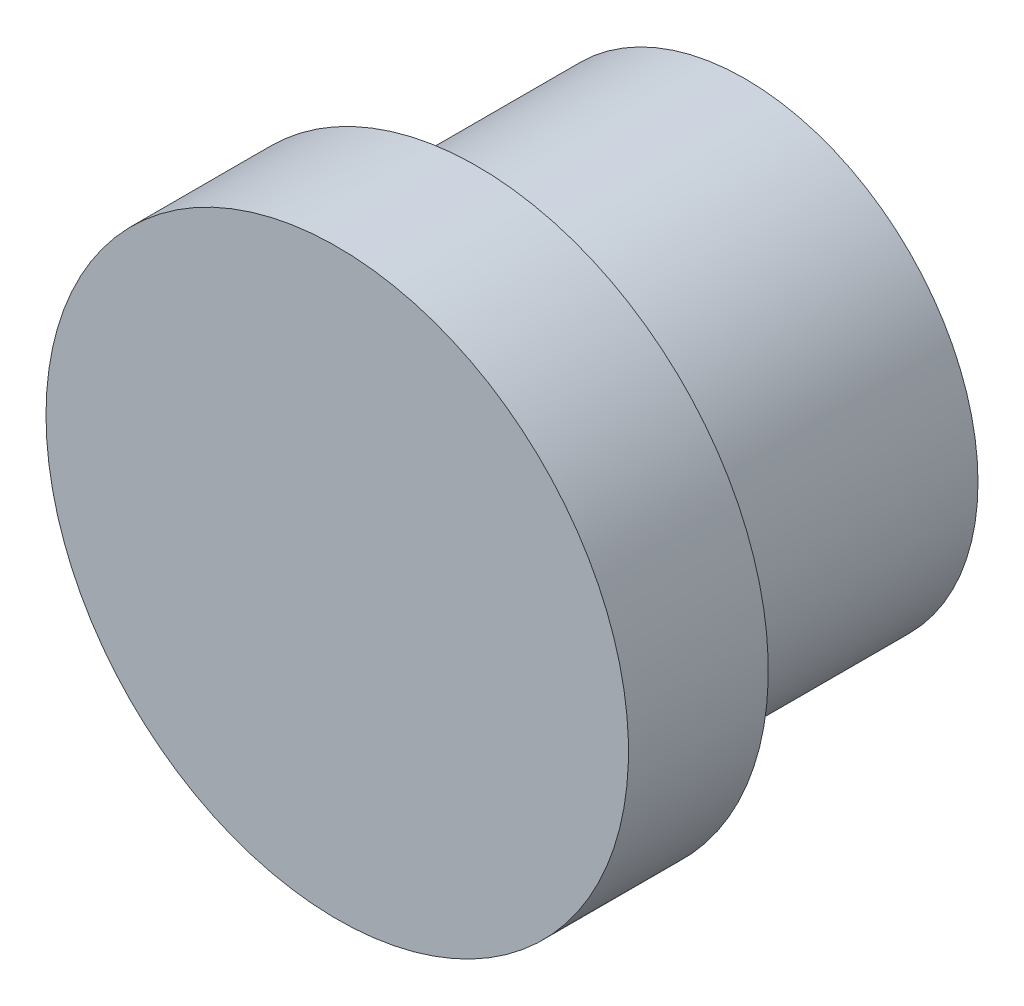
ISO-10303-21;
HEADER;
FILE_DESCRIPTION(('STEP AP214'),'2;1');
FILE_NAME('part.step','',(''),(''),'','','');
FILE_SCHEMA(('AUTOMOTIVE_DESIGN { 1 0 10303 214 1 1 1 1 }'));
ENDSEC;
DATA;
#1=APPLICATION_CONTEXT('core data for automotive mechanical design processes');
#2=APPLICATION_PROTOCOL_DEFINITION('international standard','automotive_design',2000,#1);
#3=PRODUCT_CONTEXT('',#1,'mechanical');
#4=PRODUCT('Part','Part','',(#3));
#5=PRODUCT_RELATED_PRODUCT_CATEGORY('part','',(#4));
#6=PRODUCT_DEFINITION_FORMATION('','',#4);
#7=PRODUCT_DEFINITION_CONTEXT('part definition',#1,'design');
#8=PRODUCT_DEFINITION('design','',#6,#7);
#9=PRODUCT_DEFINITION_SHAPE('','',#8);
#10=(LENGTH_UNIT() NAMED_UNIT(*) SI_UNIT(.MILLI.,.METRE.));
#11=(NAMED_UNIT(*) PLANE_ANGLE_UNIT() SI_UNIT($,.RADIAN.));
#12=(NAMED_UNIT(*) SI_UNIT($,.STERADIAN.) SOLID_ANGLE_UNIT());
#13=UNCERTAINTY_MEASURE_WITH_UNIT(LENGTH_MEASURE(1.E-05),#10,'distance_accuracy_value','');
#14=(GEOMETRIC_REPRESENTATION_CONTEXT(3) GLOBAL_UNCERTAINTY_ASSIGNED_CONTEXT((#13)) GLOBAL_UNIT_ASSIGNED_CONTEXT((#10,
#11,#12)) REPRESENTATION_CONTEXT('',''));
#15=CARTESIAN_POINT('',(0.,0.,0.));
#16=DIRECTION('',(0.,0.,1.));
#17=DIRECTION('',(1.,0.,0.));
#18=AXIS2_PLACEMENT_3D('',#15,#16,#17);
#19=CARTESIAN_POINT('',(-14.1000000000013,-193.95,252.124757540875));
#20=DIRECTION('',(0.,0.,-1.));
#21=DIRECTION('',(0.,-1.,0.));
#22=AXIS2_PLACEMENT_3D('',#19,#20,#21);
#23=PLANE('',#22);
#24=CARTESIAN_POINT('',(-14.1000000000013,-193.95,252.124757540875));
#25=DIRECTION('',(0.,0.,-1.));
#26=DIRECTION('',(-1.,0.,0.));
#27=AXIS2_PLACEMENT_3D('',#24,#25,#26);
#28=CIRCLE('',#27,2.5);
#29=CARTESIAN_POINT('',(-16.6000000000013,-193.95,252.124757540875));
#30=VERTEX_POINT('',#29);
#31=EDGE_CURVE('E47',#30,#30,#28,.T.);
#32=ORIENTED_EDGE('',*,*,#31,.F.);
#33=EDGE_LOOP('',(#32));
#34=FACE_BOUND('',#33,.T.);
#35=ADVANCED_FACE('F43',(#34),#23,.F.);
#36=CARTESIAN_POINT('',(-14.1000000000013,-193.95,250.924757540876));
#37=DIRECTION('',(0.,0.,-1.));
#38=DIRECTION('',(0.,-1.,0.));
#39=AXIS2_PLACEMENT_3D('',#36,#37,#38);
#40=PLANE('',#39);
#41=CARTESIAN_POINT('',(-14.1000000000013,-193.95,250.924757540876));
#42=DIRECTION('',(0.,0.,-1.));
#43=DIRECTION('',(-1.,0.,0.));
#44=AXIS2_PLACEMENT_3D('',#41,#42,#43);
#45=CIRCLE('',#44,2.5);
#46=CARTESIAN_POINT('',(-16.6000000000013,-193.95,250.924757540876));
#47=VERTEX_POINT('',#46);
#48=EDGE_CURVE('E11',#47,#47,#45,.T.);
#49=ORIENTED_EDGE('',*,*,#48,.T.);
#50=EDGE_LOOP('',(#49));
#51=FACE_BOUND('',#50,.T.);
#52=CARTESIAN_POINT('',(-14.1000000000013,-193.95,250.924757540876));
#53=DIRECTION('',(0.,0.,1.));
#54=DIRECTION('',(-1.,0.,0.));
#55=AXIS2_PLACEMENT_3D('',#52,#53,#54);
#56=CIRCLE('',#55,2.);
#57=CARTESIAN_POINT('',(-16.1000000000013,-193.95,250.924757540876));
#58=VERTEX_POINT('',#57);
#59=EDGE_CURVE('E64',#58,#58,#56,.T.);
#60=ORIENTED_EDGE('',*,*,#59,.T.);
#61=EDGE_LOOP('',(#60));
#62=FACE_BOUND('',#61,.T.);
#63=ADVANCED_FACE('F45',(#51,#62),#40,.T.);
#64=CARTESIAN_POINT('',(-14.1000000000013,-193.95,252.124757540875));
#65=DIRECTION('',(0.,0.,-1.));
#66=DIRECTION('',(-1.,0.,0.));
#67=AXIS2_PLACEMENT_3D('',#64,#65,#66);
#68=CYLINDRICAL_SURFACE('',#67,2.5);
#69=ORIENTED_EDGE('',*,*,#48,.F.);
#70=EDGE_LOOP('',(#69));
#71=FACE_BOUND('',#70,.T.);
#72=ORIENTED_EDGE('',*,*,#31,.T.);
#73=EDGE_LOOP('',(#72));
#74=FACE_BOUND('',#73,.T.);
#75=ADVANCED_FACE('F74',(#71,#74),#68,.T.);
#76=CARTESIAN_POINT('',(-14.1000000000013,-193.95,248.624757540876));
#77=DIRECTION('',(0.,0.,-1.));
#78=DIRECTION('',(0.,-1.,0.));
#79=AXIS2_PLACEMENT_3D('',#76,#77,#78);
#80=PLANE('',#79);
#81=CARTESIAN_POINT('',(-14.1000000000013,-193.95,248.624757540876));
#82=DIRECTION('',(0.,0.,-1.));
#83=DIRECTION('',(-1.,0.,0.));
#84=AXIS2_PLACEMENT_3D('',#81,#82,#83);
#85=CIRCLE('',#84,2.);
#86=CARTESIAN_POINT('',(-16.1000000000013,-193.95,248.624757540876));
#87=VERTEX_POINT('',#86);
#88=EDGE_CURVE('E68',#87,#87,#85,.T.);
#89=ORIENTED_EDGE('',*,*,#88,.T.);
#90=EDGE_LOOP('',(#89));
#91=FACE_BOUND('',#90,.T.);
#92=ADVANCED_FACE('F69',(#91),#80,.T.);
#93=CARTESIAN_POINT('',(-14.1000000000013,-193.95,252.124757540875));
#94=DIRECTION('',(0.,0.,-1.));
#95=DIRECTION('',(-1.,0.,0.));
#96=AXIS2_PLACEMENT_3D('',#93,#94,#95);
#97=CYLINDRICAL_SURFACE('',#96,2.);
#98=ORIENTED_EDGE('',*,*,#88,.F.);
#99=EDGE_LOOP('',(#98));
#100=FACE_BOUND('',#99,.T.);
#101=ORIENTED_EDGE('',*,*,#59,.F.);
#102=EDGE_LOOP('',(#101));
#103=FACE_BOUND('',#102,.T.);
#104=ADVANCED_FACE('F84',(#100,#103),#97,.T.);
#105=CLOSED_SHELL('',(#35,#63,#75,#92,#104));
#106=MANIFOLD_SOLID_BREP('B2',#105);
#107=ADVANCED_BREP_SHAPE_REPRESENTATION('',(#18,#106),#14);
#108=SHAPE_DEFINITION_REPRESENTATION(#9,#107);
ENDSEC;
END-ISO-10303-21;
